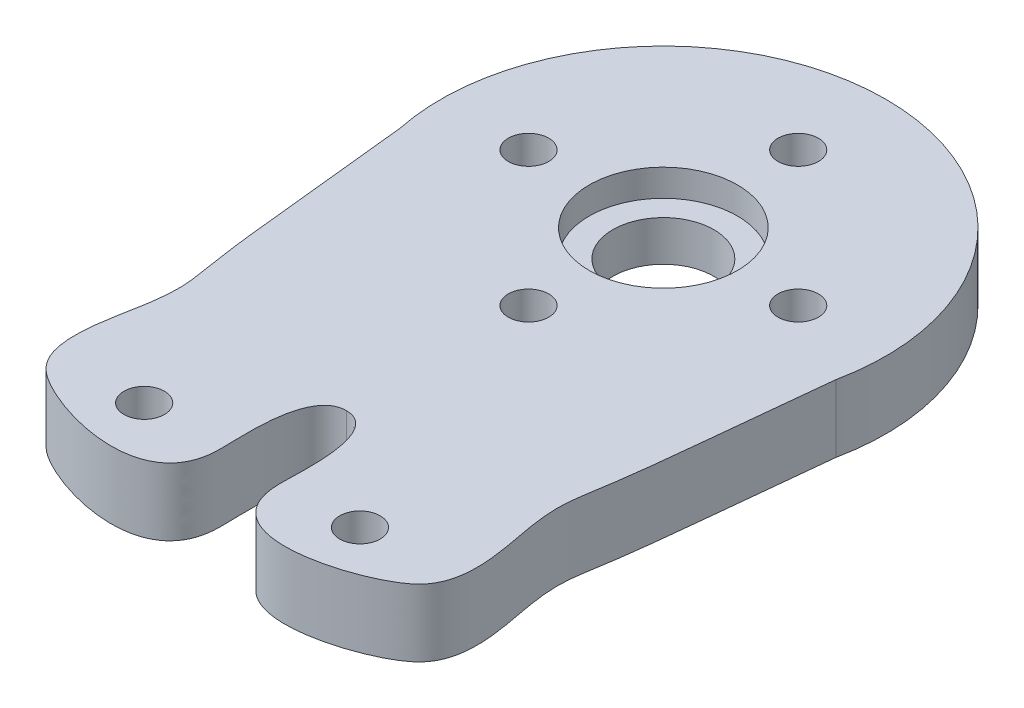
ISO-10303-21;
HEADER;
FILE_DESCRIPTION(('STEP AP214'),'2;1');
FILE_NAME('part.step','',(''),(''),'','','');
FILE_SCHEMA(('AUTOMOTIVE_DESIGN { 1 0 10303 214 1 1 1 1 }'));
ENDSEC;
DATA;
#1=APPLICATION_CONTEXT('core data for automotive mechanical design processes');
#2=APPLICATION_PROTOCOL_DEFINITION('international standard','automotive_design',2000,#1);
#3=PRODUCT_CONTEXT('',#1,'mechanical');
#4=PRODUCT('Part','Part','',(#3));
#5=PRODUCT_RELATED_PRODUCT_CATEGORY('part','',(#4));
#6=PRODUCT_DEFINITION_FORMATION('','',#4);
#7=PRODUCT_DEFINITION_CONTEXT('part definition',#1,'design');
#8=PRODUCT_DEFINITION('design','',#6,#7);
#9=PRODUCT_DEFINITION_SHAPE('','',#8);
#10=(LENGTH_UNIT() NAMED_UNIT(*) SI_UNIT(.MILLI.,.METRE.));
#11=(NAMED_UNIT(*) PLANE_ANGLE_UNIT() SI_UNIT($,.RADIAN.));
#12=(NAMED_UNIT(*) SI_UNIT($,.STERADIAN.) SOLID_ANGLE_UNIT());
#13=UNCERTAINTY_MEASURE_WITH_UNIT(LENGTH_MEASURE(1.E-05),#10,'distance_accuracy_value','');
#14=(GEOMETRIC_REPRESENTATION_CONTEXT(3) GLOBAL_UNCERTAINTY_ASSIGNED_CONTEXT((#13)) GLOBAL_UNIT_ASSIGNED_CONTEXT((#10,
#11,#12)) REPRESENTATION_CONTEXT('',''));
#15=CARTESIAN_POINT('',(0.,0.,0.));
#16=DIRECTION('',(0.,0.,1.));
#17=DIRECTION('',(1.,0.,0.));
#18=AXIS2_PLACEMENT_3D('',#15,#16,#17);
#19=CARTESIAN_POINT('',(0.,5.,0.));
#20=DIRECTION('',(0.,-1.,0.));
#21=DIRECTION('',(0.,0.,-1.));
#22=AXIS2_PLACEMENT_3D('',#19,#20,#21);
#23=CYLINDRICAL_SURFACE('',#22,3.75);
#24=CARTESIAN_POINT('',(0.,0.,0.));
#25=DIRECTION('',(0.,1.,0.));
#26=DIRECTION('',(0.,0.,1.));
#27=AXIS2_PLACEMENT_3D('',#24,#25,#26);
#28=CIRCLE('',#27,3.75);
#29=CARTESIAN_POINT('',(0.,0.,3.75));
#30=VERTEX_POINT('',#29);
#31=EDGE_CURVE('E180',#30,#30,#28,.T.);
#32=ORIENTED_EDGE('',*,*,#31,.F.);
#33=EDGE_LOOP('',(#32));
#34=FACE_BOUND('',#33,.T.);
#35=CARTESIAN_POINT('',(0.,3.,0.));
#36=DIRECTION('',(0.,1.,0.));
#37=DIRECTION('',(0.,0.,1.));
#38=AXIS2_PLACEMENT_3D('',#35,#36,#37);
#39=CIRCLE('',#38,3.75);
#40=CARTESIAN_POINT('',(0.,3.,3.75));
#41=VERTEX_POINT('',#40);
#42=EDGE_CURVE('E185',#41,#41,#39,.T.);
#43=ORIENTED_EDGE('',*,*,#42,.T.);
#44=EDGE_LOOP('',(#43));
#45=FACE_BOUND('',#44,.T.);
#46=ADVANCED_FACE('F43',(#34,#45),#23,.F.);
#47=CARTESIAN_POINT('',(0.,5.,0.));
#48=DIRECTION('',(0.,1.,0.));
#49=DIRECTION('',(0.,0.,1.));
#50=AXIS2_PLACEMENT_3D('',#47,#48,#49);
#51=PLANE('',#50);
#52=CARTESIAN_POINT('',(0.,5.,0.));
#53=DIRECTION('',(0.,1.,0.));
#54=DIRECTION('',(0.,0.,1.));
#55=AXIS2_PLACEMENT_3D('',#52,#53,#54);
#56=CIRCLE('',#55,16.5);
#57=CARTESIAN_POINT('',(16.1535855248539,5.,3.36328332009525));
#58=VERTEX_POINT('',#57);
#59=CARTESIAN_POINT('',(-16.1535855248539,5.,3.36328332009524));
#60=VERTEX_POINT('',#59);
#61=EDGE_CURVE('E178',#58,#60,#56,.T.);
#62=ORIENTED_EDGE('',*,*,#61,.T.);
#63=CARTESIAN_POINT('',(-16.4999992526094,5.,0.00496627502048361));
#64=CARTESIAN_POINT('',(-14.7897206769946,5.,16.6018741411366));
#65=CARTESIAN_POINT('',(-14.7798111612056,5.,16.4389731638313));
#66=CARTESIAN_POINT('',(-14.2007326178559,5.,20.551745368853));
#67=CARTESIAN_POINT('',(-13.6355206605634,5.,22.4856023754923));
#68=CARTESIAN_POINT('',(-15.7332672926892,5.,30.4196101932948));
#69=CARTESIAN_POINT('',(-11.3763672698114,5.,34.0736061254484));
#70=CARTESIAN_POINT('',(-1.56418736040587,5.,36.4979809960079));
#71=CARTESIAN_POINT('',(-2.41628191388143,5.,27.9759051430842));
#72=CARTESIAN_POINT('',(-1.88882279632222,5.,23.5));
#73=CARTESIAN_POINT('',(0.,5.,23.5));
#74=B_SPLINE_CURVE_WITH_KNOTS('',3,(#63,#64,#65,#66,#67,#68,#69,#70,#71,#72,#73),.UNSPECIFIED.,
.F.,.F.,(4,1,1,1,1,1,1,1,4),(0.,0.196162037089319,0.243215430463547,0.470533933742281,
0.661030556248264,0.708413552950277,0.91814719544995,0.949927510686168,1.),.UNSPECIFIED.);
#75=CARTESIAN_POINT('',(0.,5.,23.5));
#76=VERTEX_POINT('',#75);
#77=EDGE_CURVE('E102',#60,#76,#74,.T.);
#78=ORIENTED_EDGE('',*,*,#77,.T.);
#79=CARTESIAN_POINT('',(0.,5.,23.5));
#80=CARTESIAN_POINT('',(1.88882279632222,5.,23.5));
#81=CARTESIAN_POINT('',(2.41628191388143,5.,27.9759051430842));
#82=CARTESIAN_POINT('',(1.56418736040587,5.,36.4979809960079));
#83=CARTESIAN_POINT('',(11.3763672698114,5.,34.0736061254484));
#84=CARTESIAN_POINT('',(15.7332672926892,5.,30.4196101932948));
#85=CARTESIAN_POINT('',(13.6355206605634,5.,22.4856023754923));
#86=CARTESIAN_POINT('',(14.2007326178559,5.,20.551745368853));
#87=CARTESIAN_POINT('',(14.7798111612056,5.,16.4389731638313));
#88=CARTESIAN_POINT('',(14.7897206769946,5.,16.6018741411366));
#89=CARTESIAN_POINT('',(16.4999992526094,5.,0.00496627502048361));
#90=B_SPLINE_CURVE_WITH_KNOTS('',3,(#79,#80,#81,#82,#83,#84,#85,#86,#87,#88,#89),.UNSPECIFIED.,
.F.,.F.,(4,1,1,1,1,1,1,1,4),(0.,0.0500724893138318,0.08185280455005,0.291586447049723,
0.338969443751736,0.529466066257719,0.756784569536453,0.803837962910681,1.),.UNSPECIFIED.);
#91=EDGE_CURVE('E58',#76,#58,#90,.T.);
#92=ORIENTED_EDGE('',*,*,#91,.T.);
#93=EDGE_LOOP('',(#62,#78,#92));
#94=FACE_BOUND('',#93,.T.);
#95=CARTESIAN_POINT('',(8.,5.,30.5));
#96=DIRECTION('',(0.,1.,0.));
#97=DIRECTION('',(0.,0.,-1.));
#98=AXIS2_PLACEMENT_3D('',#95,#96,#97);
#99=CIRCLE('',#98,1.5);
#100=CARTESIAN_POINT('',(8.,5.,29.));
#101=VERTEX_POINT('',#100);
#102=EDGE_CURVE('E272',#101,#101,#99,.T.);
#103=ORIENTED_EDGE('',*,*,#102,.F.);
#104=EDGE_LOOP('',(#103));
#105=FACE_BOUND('',#104,.T.);
#106=CARTESIAN_POINT('',(-8.,5.,30.5));
#107=DIRECTION('',(0.,1.,0.));
#108=DIRECTION('',(0.,0.,1.));
#109=AXIS2_PLACEMENT_3D('',#106,#107,#108);
#110=CIRCLE('',#109,1.5);
#111=CARTESIAN_POINT('',(-8.,5.,32.));
#112=VERTEX_POINT('',#111);
#113=EDGE_CURVE('E265',#112,#112,#110,.T.);
#114=ORIENTED_EDGE('',*,*,#113,.F.);
#115=EDGE_LOOP('',(#114));
#116=FACE_BOUND('',#115,.T.);
#117=CARTESIAN_POINT('',(0.,5.,0.));
#118=DIRECTION('',(0.,1.,0.));
#119=DIRECTION('',(0.,0.,1.));
#120=AXIS2_PLACEMENT_3D('',#117,#118,#119);
#121=CIRCLE('',#120,5.5);
#122=CARTESIAN_POINT('',(0.,5.,5.5));
#123=VERTEX_POINT('',#122);
#124=EDGE_CURVE('E199',#123,#123,#121,.T.);
#125=ORIENTED_EDGE('',*,*,#124,.F.);
#126=EDGE_LOOP('',(#125));
#127=FACE_BOUND('',#126,.T.);
#128=CARTESIAN_POINT('',(-10.,5.,0.));
#129=DIRECTION('',(0.,1.,0.));
#130=DIRECTION('',(0.,0.,1.));
#131=AXIS2_PLACEMENT_3D('',#128,#129,#130);
#132=CIRCLE('',#131,1.5);
#133=CARTESIAN_POINT('',(-10.,5.,1.49999999999993));
#134=VERTEX_POINT('',#133);
#135=EDGE_CURVE('E211',#134,#134,#132,.T.);
#136=ORIENTED_EDGE('',*,*,#135,.F.);
#137=EDGE_LOOP('',(#136));
#138=FACE_BOUND('',#137,.T.);
#139=CARTESIAN_POINT('',(10.,5.,0.));
#140=DIRECTION('',(0.,1.,0.));
#141=DIRECTION('',(0.,0.,1.));
#142=AXIS2_PLACEMENT_3D('',#139,#140,#141);
#143=CIRCLE('',#142,1.5);
#144=CARTESIAN_POINT('',(10.,5.,1.5));
#145=VERTEX_POINT('',#144);
#146=EDGE_CURVE('E218',#145,#145,#143,.T.);
#147=ORIENTED_EDGE('',*,*,#146,.F.);
#148=EDGE_LOOP('',(#147));
#149=FACE_BOUND('',#148,.T.);
#150=CARTESIAN_POINT('',(0.,5.,10.));
#151=DIRECTION('',(0.,1.,0.));
#152=DIRECTION('',(0.,0.,1.));
#153=AXIS2_PLACEMENT_3D('',#150,#151,#152);
#154=CIRCLE('',#153,1.5);
#155=CARTESIAN_POINT('',(0.,5.,11.5));
#156=VERTEX_POINT('',#155);
#157=EDGE_CURVE('E215',#156,#156,#154,.T.);
#158=ORIENTED_EDGE('',*,*,#157,.F.);
#159=EDGE_LOOP('',(#158));
#160=FACE_BOUND('',#159,.T.);
#161=CARTESIAN_POINT('',(1.04744440165294E-13,5.,-10.));
#162=DIRECTION('',(0.,1.,0.));
#163=DIRECTION('',(0.,0.,1.));
#164=AXIS2_PLACEMENT_3D('',#161,#162,#163);
#165=CIRCLE('',#164,1.5);
#166=CARTESIAN_POINT('',(1.04744440165294E-13,5.,-8.5));
#167=VERTEX_POINT('',#166);
#168=EDGE_CURVE('E188',#167,#167,#165,.T.);
#169=ORIENTED_EDGE('',*,*,#168,.F.);
#170=EDGE_LOOP('',(#169));
#171=FACE_BOUND('',#170,.T.);
#172=ADVANCED_FACE('F167',(#94,#105,#116,#127,#138,#149,#160,#171),#51,.T.);
#173=CARTESIAN_POINT('',(0.,0.,0.));
#174=DIRECTION('',(0.,1.,0.));
#175=DIRECTION('',(0.,0.,1.));
#176=AXIS2_PLACEMENT_3D('',#173,#174,#175);
#177=PLANE('',#176);
#178=CARTESIAN_POINT('',(-16.4999992526094,0.,0.00496627502048361));
#179=CARTESIAN_POINT('',(-14.7897206769946,0.,16.6018741411366));
#180=CARTESIAN_POINT('',(-14.7798111612056,0.,16.4389731638313));
#181=CARTESIAN_POINT('',(-14.2007326178559,0.,20.551745368853));
#182=CARTESIAN_POINT('',(-13.6355206605634,0.,22.4856023754923));
#183=CARTESIAN_POINT('',(-15.7332672926892,0.,30.4196101932948));
#184=CARTESIAN_POINT('',(-11.3763672698114,0.,34.0736061254484));
#185=CARTESIAN_POINT('',(-1.56418736040587,0.,36.4979809960079));
#186=CARTESIAN_POINT('',(-2.41628191388143,0.,27.9759051430842));
#187=CARTESIAN_POINT('',(-1.88882279632222,0.,23.5));
#188=CARTESIAN_POINT('',(0.,0.,23.5));
#189=B_SPLINE_CURVE_WITH_KNOTS('',3,(#178,#179,#180,#181,#182,#183,#184,#185,#186,#187,#188),
.UNSPECIFIED.,.F.,.F.,(4,1,1,1,1,1,1,1,4),(0.,0.196162037089319,0.243215430463547,
0.470533933742281,0.661030556248264,0.708413552950277,0.91814719544995,0.949927510686168,1.),.UNSPECIFIED.);
#190=CARTESIAN_POINT('',(-16.1535855248539,0.,3.36328332009524));
#191=VERTEX_POINT('',#190);
#192=CARTESIAN_POINT('',(0.,0.,23.5));
#193=VERTEX_POINT('',#192);
#194=EDGE_CURVE('E80',#191,#193,#189,.T.);
#195=ORIENTED_EDGE('',*,*,#194,.F.);
#196=CARTESIAN_POINT('',(0.,0.,0.));
#197=DIRECTION('',(0.,1.,0.));
#198=DIRECTION('',(0.,0.,1.));
#199=AXIS2_PLACEMENT_3D('',#196,#197,#198);
#200=CIRCLE('',#199,16.5);
#201=CARTESIAN_POINT('',(16.1535855248539,0.,3.36328332009526));
#202=VERTEX_POINT('',#201);
#203=EDGE_CURVE('E92',#202,#191,#200,.T.);
#204=ORIENTED_EDGE('',*,*,#203,.F.);
#205=CARTESIAN_POINT('',(0.,0.,23.5));
#206=CARTESIAN_POINT('',(1.88882279632222,0.,23.5));
#207=CARTESIAN_POINT('',(2.41628191388143,0.,27.9759051430842));
#208=CARTESIAN_POINT('',(1.56418736040587,0.,36.4979809960079));
#209=CARTESIAN_POINT('',(11.3763672698114,0.,34.0736061254484));
#210=CARTESIAN_POINT('',(15.7332672926892,0.,30.4196101932948));
#211=CARTESIAN_POINT('',(13.6355206605634,0.,22.4856023754923));
#212=CARTESIAN_POINT('',(14.2007326178559,0.,20.551745368853));
#213=CARTESIAN_POINT('',(14.7798111612056,0.,16.4389731638313));
#214=CARTESIAN_POINT('',(14.7897206769946,0.,16.6018741411366));
#215=CARTESIAN_POINT('',(16.4999992526094,0.,0.00496627502048361));
#216=B_SPLINE_CURVE_WITH_KNOTS('',3,(#205,#206,#207,#208,#209,#210,#211,#212,#213,#214,#215),
.UNSPECIFIED.,.F.,.F.,(4,1,1,1,1,1,1,1,4),(0.,0.0500724893138318,0.08185280455005,
0.291586447049723,0.338969443751736,0.529466066257719,0.756784569536453,0.803837962910681,1.),.UNSPECIFIED.);
#217=EDGE_CURVE('E65',#193,#202,#216,.T.);
#218=ORIENTED_EDGE('',*,*,#217,.F.);
#219=EDGE_LOOP('',(#195,#204,#218));
#220=FACE_BOUND('',#219,.T.);
#221=CARTESIAN_POINT('',(8.,0.,30.5));
#222=DIRECTION('',(0.,1.,0.));
#223=DIRECTION('',(0.,0.,-1.));
#224=AXIS2_PLACEMENT_3D('',#221,#222,#223);
#225=CIRCLE('',#224,1.5);
#226=CARTESIAN_POINT('',(8.,0.,29.));
#227=VERTEX_POINT('',#226);
#228=EDGE_CURVE('E270',#227,#227,#225,.T.);
#229=ORIENTED_EDGE('',*,*,#228,.T.);
#230=EDGE_LOOP('',(#229));
#231=FACE_BOUND('',#230,.T.);
#232=CARTESIAN_POINT('',(-8.,0.,30.5));
#233=DIRECTION('',(0.,1.,0.));
#234=DIRECTION('',(0.,0.,1.));
#235=AXIS2_PLACEMENT_3D('',#232,#233,#234);
#236=CIRCLE('',#235,1.5);
#237=CARTESIAN_POINT('',(-8.,0.,32.));
#238=VERTEX_POINT('',#237);
#239=EDGE_CURVE('E263',#238,#238,#236,.T.);
#240=ORIENTED_EDGE('',*,*,#239,.T.);
#241=EDGE_LOOP('',(#240));
#242=FACE_BOUND('',#241,.T.);
#243=CARTESIAN_POINT('',(0.,0.,10.));
#244=DIRECTION('',(0.,1.,0.));
#245=DIRECTION('',(0.,0.,1.));
#246=AXIS2_PLACEMENT_3D('',#243,#244,#245);
#247=CIRCLE('',#246,1.5);
#248=CARTESIAN_POINT('',(0.,0.,11.5));
#249=VERTEX_POINT('',#248);
#250=EDGE_CURVE('E214',#249,#249,#247,.T.);
#251=ORIENTED_EDGE('',*,*,#250,.T.);
#252=EDGE_LOOP('',(#251));
#253=FACE_BOUND('',#252,.T.);
#254=ORIENTED_EDGE('',*,*,#31,.T.);
#255=EDGE_LOOP('',(#254));
#256=FACE_BOUND('',#255,.T.);
#257=CARTESIAN_POINT('',(1.04744440165294E-13,0.,-10.));
#258=DIRECTION('',(0.,1.,0.));
#259=DIRECTION('',(0.,0.,1.));
#260=AXIS2_PLACEMENT_3D('',#257,#258,#259);
#261=CIRCLE('',#260,3.);
#262=CARTESIAN_POINT('',(1.04744440165294E-13,0.,-7.));
#263=VERTEX_POINT('',#262);
#264=EDGE_CURVE('E234',#263,#263,#261,.T.);
#265=ORIENTED_EDGE('',*,*,#264,.T.);
#266=EDGE_LOOP('',(#265));
#267=FACE_BOUND('',#266,.T.);
#268=CARTESIAN_POINT('',(-10.,0.,0.));
#269=DIRECTION('',(0.,1.,0.));
#270=DIRECTION('',(0.,0.,1.));
#271=AXIS2_PLACEMENT_3D('',#268,#269,#270);
#272=CIRCLE('',#271,3.);
#273=CARTESIAN_POINT('',(-10.,0.,2.99999999999993));
#274=VERTEX_POINT('',#273);
#275=EDGE_CURVE('E238',#274,#274,#272,.T.);
#276=ORIENTED_EDGE('',*,*,#275,.T.);
#277=EDGE_LOOP('',(#276));
#278=FACE_BOUND('',#277,.T.);
#279=CARTESIAN_POINT('',(10.,0.,0.));
#280=DIRECTION('',(0.,1.,0.));
#281=DIRECTION('',(0.,0.,1.));
#282=AXIS2_PLACEMENT_3D('',#279,#280,#281);
#283=CIRCLE('',#282,3.);
#284=CARTESIAN_POINT('',(10.,0.,3.));
#285=VERTEX_POINT('',#284);
#286=EDGE_CURVE('E241',#285,#285,#283,.T.);
#287=ORIENTED_EDGE('',*,*,#286,.T.);
#288=EDGE_LOOP('',(#287));
#289=FACE_BOUND('',#288,.T.);
#290=ADVANCED_FACE('F90',(#220,#231,#242,#253,#256,#267,#278,#289),#177,.F.);
#291=CARTESIAN_POINT('',(0.,5.,0.));
#292=DIRECTION('',(0.,-1.,0.));
#293=DIRECTION('',(0.,0.,-1.));
#294=AXIS2_PLACEMENT_3D('',#291,#292,#293);
#295=CYLINDRICAL_SURFACE('',#294,16.5);
#296=ORIENTED_EDGE('',*,*,#61,.F.);
#297=DIRECTION('',(0.,1.,0.));
#298=VECTOR('',#297,1.);
#299=CARTESIAN_POINT('',(16.1535855248539,0.,3.36328332009526));
#300=LINE('',#299,#298);
#301=EDGE_CURVE('E51',#58,#202,#300,.F.);
#302=ORIENTED_EDGE('',*,*,#301,.T.);
#303=ORIENTED_EDGE('',*,*,#203,.T.);
#304=DIRECTION('',(0.,1.,0.));
#305=VECTOR('',#304,1.);
#306=CARTESIAN_POINT('',(-16.1535855248539,0.,3.36328332009527));
#307=LINE('',#306,#305);
#308=EDGE_CURVE('E11',#191,#60,#307,.T.);
#309=ORIENTED_EDGE('',*,*,#308,.T.);
#310=EDGE_LOOP('',(#296,#302,#303,#309));
#311=FACE_BOUND('',#310,.T.);
#312=ADVANCED_FACE('F45',(#311),#295,.T.);
#313=CARTESIAN_POINT('',(10.,5.,0.));
#314=DIRECTION('',(0.,-1.,0.));
#315=DIRECTION('',(0.,0.,-1.));
#316=AXIS2_PLACEMENT_3D('',#313,#314,#315);
#317=CYLINDRICAL_SURFACE('',#316,1.5);
#318=CARTESIAN_POINT('',(10.,2.5,0.));
#319=DIRECTION('',(0.,1.,0.));
#320=DIRECTION('',(0.,0.,1.));
#321=AXIS2_PLACEMENT_3D('',#318,#319,#320);
#322=CIRCLE('',#321,1.5);
#323=CARTESIAN_POINT('',(10.,2.5,1.5));
#324=VERTEX_POINT('',#323);
#325=EDGE_CURVE('E197',#324,#324,#322,.T.);
#326=ORIENTED_EDGE('',*,*,#325,.F.);
#327=EDGE_LOOP('',(#326));
#328=FACE_BOUND('',#327,.T.);
#329=ORIENTED_EDGE('',*,*,#146,.T.);
#330=EDGE_LOOP('',(#329));
#331=FACE_BOUND('',#330,.T.);
#332=ADVANCED_FACE('F160',(#328,#331),#317,.F.);
#333=CARTESIAN_POINT('',(0.,5.,10.));
#334=DIRECTION('',(0.,-1.,0.));
#335=DIRECTION('',(0.,0.,-1.));
#336=AXIS2_PLACEMENT_3D('',#333,#334,#335);
#337=CYLINDRICAL_SURFACE('',#336,1.5);
#338=ORIENTED_EDGE('',*,*,#157,.T.);
#339=EDGE_LOOP('',(#338));
#340=FACE_BOUND('',#339,.T.);
#341=ORIENTED_EDGE('',*,*,#250,.F.);
#342=EDGE_LOOP('',(#341));
#343=FACE_BOUND('',#342,.T.);
#344=ADVANCED_FACE('F156',(#340,#343),#337,.F.);
#345=CARTESIAN_POINT('',(-10.,5.,0.));
#346=DIRECTION('',(0.,-1.,0.));
#347=DIRECTION('',(0.,0.,-1.));
#348=AXIS2_PLACEMENT_3D('',#345,#346,#347);
#349=CYLINDRICAL_SURFACE('',#348,1.5);
#350=CARTESIAN_POINT('',(-10.,2.5,0.));
#351=DIRECTION('',(0.,1.,0.));
#352=DIRECTION('',(0.,0.,1.));
#353=AXIS2_PLACEMENT_3D('',#350,#351,#352);
#354=CIRCLE('',#353,1.5);
#355=CARTESIAN_POINT('',(-10.,2.5,1.49999999999993));
#356=VERTEX_POINT('',#355);
#357=EDGE_CURVE('E193',#356,#356,#354,.T.);
#358=ORIENTED_EDGE('',*,*,#357,.F.);
#359=EDGE_LOOP('',(#358));
#360=FACE_BOUND('',#359,.T.);
#361=ORIENTED_EDGE('',*,*,#135,.T.);
#362=EDGE_LOOP('',(#361));
#363=FACE_BOUND('',#362,.T.);
#364=ADVANCED_FACE('F152',(#360,#363),#349,.F.);
#365=CARTESIAN_POINT('',(1.04744440165294E-13,5.,-10.));
#366=DIRECTION('',(0.,-1.,0.));
#367=DIRECTION('',(0.,0.,-1.));
#368=AXIS2_PLACEMENT_3D('',#365,#366,#367);
#369=CYLINDRICAL_SURFACE('',#368,1.5);
#370=CARTESIAN_POINT('',(1.04744440165294E-13,2.5,-10.));
#371=DIRECTION('',(0.,1.,0.));
#372=DIRECTION('',(0.,0.,1.));
#373=AXIS2_PLACEMENT_3D('',#370,#371,#372);
#374=CIRCLE('',#373,1.5);
#375=CARTESIAN_POINT('',(1.04744440165294E-13,2.5,-8.5));
#376=VERTEX_POINT('',#375);
#377=EDGE_CURVE('E190',#376,#376,#374,.T.);
#378=ORIENTED_EDGE('',*,*,#377,.F.);
#379=EDGE_LOOP('',(#378));
#380=FACE_BOUND('',#379,.T.);
#381=ORIENTED_EDGE('',*,*,#168,.T.);
#382=EDGE_LOOP('',(#381));
#383=FACE_BOUND('',#382,.T.);
#384=ADVANCED_FACE('F148',(#380,#383),#369,.F.);
#385=CARTESIAN_POINT('',(0.,3.,0.));
#386=DIRECTION('',(0.,1.,0.));
#387=DIRECTION('',(0.,0.,1.));
#388=AXIS2_PLACEMENT_3D('',#385,#386,#387);
#389=CYLINDRICAL_SURFACE('',#388,5.5);
#390=CARTESIAN_POINT('',(0.,3.,0.));
#391=DIRECTION('',(0.,1.,0.));
#392=DIRECTION('',(0.,0.,1.));
#393=AXIS2_PLACEMENT_3D('',#390,#391,#392);
#394=CIRCLE('',#393,5.5);
#395=CARTESIAN_POINT('',(0.,3.,5.5));
#396=VERTEX_POINT('',#395);
#397=EDGE_CURVE('E189',#396,#396,#394,.T.);
#398=ORIENTED_EDGE('',*,*,#397,.F.);
#399=EDGE_LOOP('',(#398));
#400=FACE_BOUND('',#399,.T.);
#401=ORIENTED_EDGE('',*,*,#124,.T.);
#402=EDGE_LOOP('',(#401));
#403=FACE_BOUND('',#402,.T.);
#404=ADVANCED_FACE('F144',(#400,#403),#389,.F.);
#405=CARTESIAN_POINT('',(0.,3.,0.));
#406=DIRECTION('',(0.,1.,0.));
#407=DIRECTION('',(0.,0.,1.));
#408=AXIS2_PLACEMENT_3D('',#405,#406,#407);
#409=PLANE('',#408);
#410=ORIENTED_EDGE('',*,*,#42,.F.);
#411=EDGE_LOOP('',(#410));
#412=FACE_BOUND('',#411,.T.);
#413=ORIENTED_EDGE('',*,*,#397,.T.);
#414=EDGE_LOOP('',(#413));
#415=FACE_BOUND('',#414,.T.);
#416=ADVANCED_FACE('F137',(#412,#415),#409,.T.);
#417=CARTESIAN_POINT('',(1.04744440165294E-13,2.5,-10.));
#418=DIRECTION('',(0.,-1.,0.));
#419=DIRECTION('',(0.,0.,-1.));
#420=AXIS2_PLACEMENT_3D('',#417,#418,#419);
#421=CYLINDRICAL_SURFACE('',#420,3.);
#422=CARTESIAN_POINT('',(1.04744440165294E-13,2.5,-10.));
#423=DIRECTION('',(0.,1.,0.));
#424=DIRECTION('',(0.,0.,1.));
#425=AXIS2_PLACEMENT_3D('',#422,#423,#424);
#426=CIRCLE('',#425,3.);
#427=CARTESIAN_POINT('',(1.04744440165294E-13,2.5,-7.));
#428=VERTEX_POINT('',#427);
#429=EDGE_CURVE('E88',#428,#428,#426,.T.);
#430=ORIENTED_EDGE('',*,*,#429,.T.);
#431=EDGE_LOOP('',(#430));
#432=FACE_BOUND('',#431,.T.);
#433=ORIENTED_EDGE('',*,*,#264,.F.);
#434=EDGE_LOOP('',(#433));
#435=FACE_BOUND('',#434,.T.);
#436=ADVANCED_FACE('F134',(#432,#435),#421,.F.);
#437=CARTESIAN_POINT('',(1.04744440165294E-13,2.5,-10.));
#438=DIRECTION('',(0.,1.,0.));
#439=DIRECTION('',(0.,0.,1.));
#440=AXIS2_PLACEMENT_3D('',#437,#438,#439);
#441=PLANE('',#440);
#442=ORIENTED_EDGE('',*,*,#377,.T.);
#443=EDGE_LOOP('',(#442));
#444=FACE_BOUND('',#443,.T.);
#445=ORIENTED_EDGE('',*,*,#429,.F.);
#446=EDGE_LOOP('',(#445));
#447=FACE_BOUND('',#446,.T.);
#448=ADVANCED_FACE('F129',(#444,#447),#441,.F.);
#449=CARTESIAN_POINT('',(-10.,2.5,0.));
#450=DIRECTION('',(0.,-1.,0.));
#451=DIRECTION('',(0.,0.,-1.));
#452=AXIS2_PLACEMENT_3D('',#449,#450,#451);
#453=CYLINDRICAL_SURFACE('',#452,3.);
#454=CARTESIAN_POINT('',(-10.,2.5,0.));
#455=DIRECTION('',(0.,1.,0.));
#456=DIRECTION('',(0.,0.,1.));
#457=AXIS2_PLACEMENT_3D('',#454,#455,#456);
#458=CIRCLE('',#457,3.);
#459=CARTESIAN_POINT('',(-10.,2.5,2.99999999999993));
#460=VERTEX_POINT('',#459);
#461=EDGE_CURVE('E246',#460,#460,#458,.T.);
#462=ORIENTED_EDGE('',*,*,#461,.T.);
#463=EDGE_LOOP('',(#462));
#464=FACE_BOUND('',#463,.T.);
#465=ORIENTED_EDGE('',*,*,#275,.F.);
#466=EDGE_LOOP('',(#465));
#467=FACE_BOUND('',#466,.T.);
#468=ADVANCED_FACE('F126',(#464,#467),#453,.F.);
#469=CARTESIAN_POINT('',(-10.,2.5,0.));
#470=DIRECTION('',(0.,1.,0.));
#471=DIRECTION('',(0.,0.,1.));
#472=AXIS2_PLACEMENT_3D('',#469,#470,#471);
#473=PLANE('',#472);
#474=ORIENTED_EDGE('',*,*,#357,.T.);
#475=EDGE_LOOP('',(#474));
#476=FACE_BOUND('',#475,.T.);
#477=ORIENTED_EDGE('',*,*,#461,.F.);
#478=EDGE_LOOP('',(#477));
#479=FACE_BOUND('',#478,.T.);
#480=ADVANCED_FACE('F124',(#476,#479),#473,.F.);
#481=CARTESIAN_POINT('',(10.,2.5,0.));
#482=DIRECTION('',(0.,-1.,0.));
#483=DIRECTION('',(0.,0.,-1.));
#484=AXIS2_PLACEMENT_3D('',#481,#482,#483);
#485=CYLINDRICAL_SURFACE('',#484,3.);
#486=CARTESIAN_POINT('',(10.,2.5,0.));
#487=DIRECTION('',(0.,1.,0.));
#488=DIRECTION('',(0.,0.,1.));
#489=AXIS2_PLACEMENT_3D('',#486,#487,#488);
#490=CIRCLE('',#489,3.);
#491=CARTESIAN_POINT('',(10.,2.5,3.));
#492=VERTEX_POINT('',#491);
#493=EDGE_CURVE('E194',#492,#492,#490,.T.);
#494=ORIENTED_EDGE('',*,*,#493,.T.);
#495=EDGE_LOOP('',(#494));
#496=FACE_BOUND('',#495,.T.);
#497=ORIENTED_EDGE('',*,*,#286,.F.);
#498=EDGE_LOOP('',(#497));
#499=FACE_BOUND('',#498,.T.);
#500=ADVANCED_FACE('F120',(#496,#499),#485,.F.);
#501=CARTESIAN_POINT('',(10.,2.5,0.));
#502=DIRECTION('',(0.,1.,0.));
#503=DIRECTION('',(0.,0.,1.));
#504=AXIS2_PLACEMENT_3D('',#501,#502,#503);
#505=PLANE('',#504);
#506=ORIENTED_EDGE('',*,*,#325,.T.);
#507=EDGE_LOOP('',(#506));
#508=FACE_BOUND('',#507,.T.);
#509=ORIENTED_EDGE('',*,*,#493,.F.);
#510=EDGE_LOOP('',(#509));
#511=FACE_BOUND('',#510,.T.);
#512=ADVANCED_FACE('F117',(#508,#511),#505,.F.);
#513=DIRECTION('',(0.,1.,0.));
#514=VECTOR('',#513,1.);
#515=SURFACE_OF_LINEAR_EXTRUSION('',#189,#514);
#516=ORIENTED_EDGE('',*,*,#308,.F.);
#517=ORIENTED_EDGE('',*,*,#194,.T.);
#518=DIRECTION('',(0.,1.,0.));
#519=VECTOR('',#518,1.);
#520=CARTESIAN_POINT('',(0.,0.,23.5));
#521=LINE('',#520,#519);
#522=EDGE_CURVE('E83',#193,#76,#521,.T.);
#523=ORIENTED_EDGE('',*,*,#522,.T.);
#524=ORIENTED_EDGE('',*,*,#77,.F.);
#525=EDGE_LOOP('',(#516,#517,#523,#524));
#526=FACE_BOUND('',#525,.T.);
#527=ADVANCED_FACE('F81',(#526),#515,.T.);
#528=DIRECTION('',(0.,1.,0.));
#529=VECTOR('',#528,1.);
#530=SURFACE_OF_LINEAR_EXTRUSION('',#216,#529);
#531=ORIENTED_EDGE('',*,*,#301,.F.);
#532=ORIENTED_EDGE('',*,*,#91,.F.);
#533=ORIENTED_EDGE('',*,*,#522,.F.);
#534=ORIENTED_EDGE('',*,*,#217,.T.);
#535=EDGE_LOOP('',(#531,#532,#533,#534));
#536=FACE_BOUND('',#535,.T.);
#537=ADVANCED_FACE('F87',(#536),#530,.T.);
#538=CARTESIAN_POINT('',(-8.,0.,30.5));
#539=DIRECTION('',(0.,1.,0.));
#540=DIRECTION('',(0.,0.,1.));
#541=AXIS2_PLACEMENT_3D('',#538,#539,#540);
#542=CYLINDRICAL_SURFACE('',#541,1.5);
#543=ORIENTED_EDGE('',*,*,#239,.F.);
#544=EDGE_LOOP('',(#543));
#545=FACE_BOUND('',#544,.T.);
#546=ORIENTED_EDGE('',*,*,#113,.T.);
#547=EDGE_LOOP('',(#546));
#548=FACE_BOUND('',#547,.T.);
#549=ADVANCED_FACE('F113',(#545,#548),#542,.F.);
#550=CARTESIAN_POINT('',(8.,0.,30.5));
#551=DIRECTION('',(0.,1.,0.));
#552=DIRECTION('',(0.,0.,1.));
#553=AXIS2_PLACEMENT_3D('',#550,#551,#552);
#554=CYLINDRICAL_SURFACE('',#553,1.5);
#555=ORIENTED_EDGE('',*,*,#228,.F.);
#556=EDGE_LOOP('',(#555));
#557=FACE_BOUND('',#556,.T.);
#558=ORIENTED_EDGE('',*,*,#102,.T.);
#559=EDGE_LOOP('',(#558));
#560=FACE_BOUND('',#559,.T.);
#561=ADVANCED_FACE('F278',(#557,#560),#554,.F.);
#562=CLOSED_SHELL('',(#46,#172,#290,#312,#332,#344,#364,#384,#404,#416,#436,#448,#468,#480,#500,
#512,#527,#537,#549,#561));
#563=MANIFOLD_SOLID_BREP('B2',#562);
#564=ADVANCED_BREP_SHAPE_REPRESENTATION('',(#18,#563),#14);
#565=SHAPE_DEFINITION_REPRESENTATION(#9,#564);
ENDSEC;
END-ISO-10303-21;
